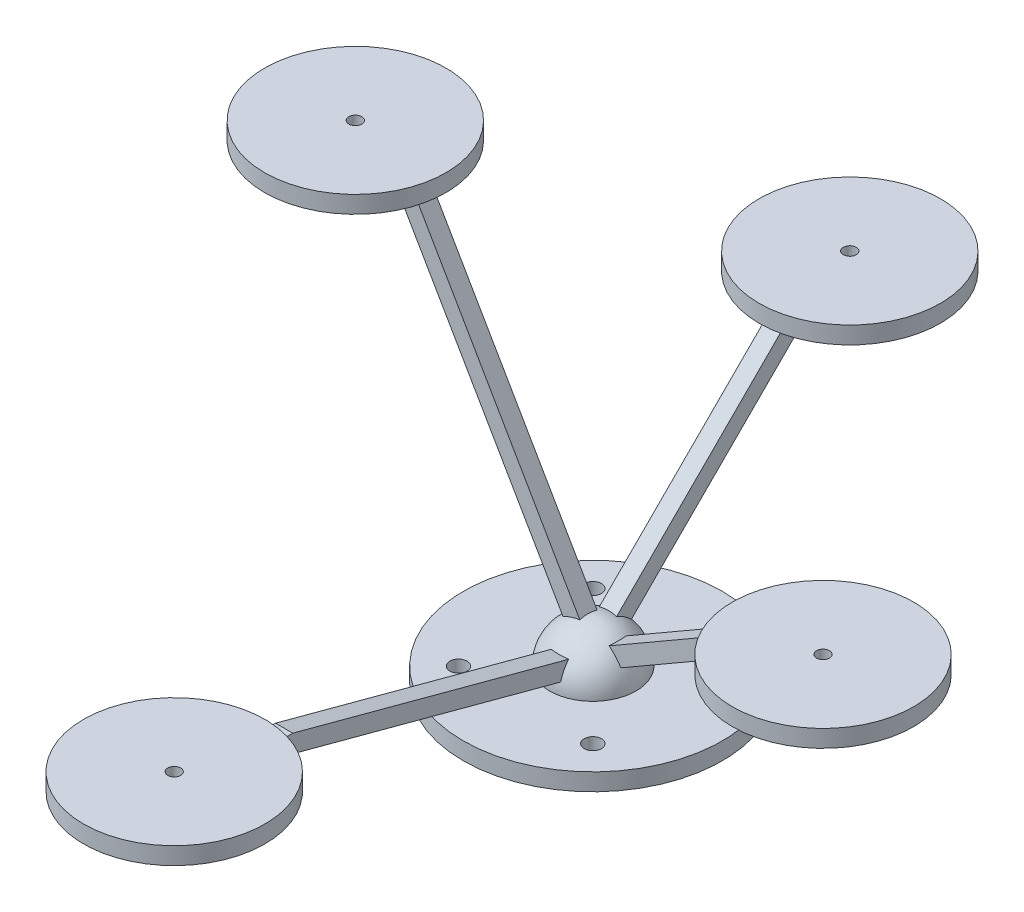
ISO-10303-21;
HEADER;
FILE_DESCRIPTION(('STEP AP214'),'2;1');
FILE_NAME('part.step','',(''),(''),'','','');
FILE_SCHEMA(('AUTOMOTIVE_DESIGN { 1 0 10303 214 1 1 1 1 }'));
ENDSEC;
DATA;
#1=APPLICATION_CONTEXT('core data for automotive mechanical design processes');
#2=APPLICATION_PROTOCOL_DEFINITION('international standard','automotive_design',2000,#1);
#3=PRODUCT_CONTEXT('',#1,'mechanical');
#4=PRODUCT('Part','Part','',(#3));
#5=PRODUCT_RELATED_PRODUCT_CATEGORY('part','',(#4));
#6=PRODUCT_DEFINITION_FORMATION('','',#4);
#7=PRODUCT_DEFINITION_CONTEXT('part definition',#1,'design');
#8=PRODUCT_DEFINITION('design','',#6,#7);
#9=PRODUCT_DEFINITION_SHAPE('','',#8);
#10=(LENGTH_UNIT() NAMED_UNIT(*) SI_UNIT(.MILLI.,.METRE.));
#11=(NAMED_UNIT(*) PLANE_ANGLE_UNIT() SI_UNIT($,.RADIAN.));
#12=(NAMED_UNIT(*) SI_UNIT($,.STERADIAN.) SOLID_ANGLE_UNIT());
#13=UNCERTAINTY_MEASURE_WITH_UNIT(LENGTH_MEASURE(1.E-05),#10,'distance_accuracy_value','');
#14=(GEOMETRIC_REPRESENTATION_CONTEXT(3) GLOBAL_UNCERTAINTY_ASSIGNED_CONTEXT((#13)) GLOBAL_UNIT_ASSIGNED_CONTEXT((#10,
#11,#12)) REPRESENTATION_CONTEXT('',''));
#15=CARTESIAN_POINT('',(0.,0.,0.));
#16=DIRECTION('',(0.,0.,1.));
#17=DIRECTION('',(1.,0.,0.));
#18=AXIS2_PLACEMENT_3D('',#15,#16,#17);
#19=CARTESIAN_POINT('',(0.,2.,0.));
#20=DIRECTION('',(0.,-1.,0.));
#21=DIRECTION('',(0.,0.,-1.));
#22=AXIS2_PLACEMENT_3D('',#19,#20,#21);
#23=SPHERICAL_SURFACE('',#22,5.);
#24=CARTESIAN_POINT('',(0.,2.,0.));
#25=DIRECTION('',(0.,1.,0.));
#26=DIRECTION('',(0.,0.,1.));
#27=AXIS2_PLACEMENT_3D('',#24,#25,#26);
#28=CIRCLE('',#27,5.);
#29=CARTESIAN_POINT('',(0.,2.,5.));
#30=VERTEX_POINT('',#29);
#31=EDGE_CURVE('E388',#30,#30,#28,.T.);
#32=ORIENTED_EDGE('',*,*,#31,.T.);
#33=EDGE_LOOP('',(#32));
#34=FACE_BOUND('',#33,.T.);
#35=CARTESIAN_POINT('',(1.73205080756889,3.,0.));
#36=DIRECTION('',(-0.86602540378444,-0.499999999999998,0.));
#37=DIRECTION('',(0.499999999999998,-0.86602540378444,0.));
#38=AXIS2_PLACEMENT_3D('',#35,#36,#37);
#39=CIRCLE('',#38,4.58257569495584);
#40=CARTESIAN_POINT('',(-0.504017169930898,6.87298334620742,-1.));
#41=VERTEX_POINT('',#40);
#42=CARTESIAN_POINT('',(-0.504017169930894,6.87298334620742,1.));
#43=VERTEX_POINT('',#42);
#44=EDGE_CURVE('E399',#41,#43,#39,.F.);
#45=ORIENTED_EDGE('',*,*,#44,.T.);
#46=CARTESIAN_POINT('',(0.,2.,1.));
#47=DIRECTION('',(0.,0.,-1.));
#48=DIRECTION('',(-1.,0.,0.));
#49=AXIS2_PLACEMENT_3D('',#46,#47,#48);
#50=CIRCLE('',#49,4.89897948556636);
#51=CARTESIAN_POINT('',(-2.44948974278317,6.24264068711929,1.));
#52=VERTEX_POINT('',#51);
#53=EDGE_CURVE('E406',#43,#52,#50,.F.);
#54=ORIENTED_EDGE('',*,*,#53,.T.);
#55=CARTESIAN_POINT('',(0.,2.,0.));
#56=DIRECTION('',(0.86602540378444,0.499999999999998,0.));
#57=DIRECTION('',(-0.499999999999998,0.86602540378444,0.));
#58=AXIS2_PLACEMENT_3D('',#55,#56,#57);
#59=CIRCLE('',#58,5.);
#60=CARTESIAN_POINT('',(-2.44948974278317,6.24264068711929,-1.));
#61=VERTEX_POINT('',#60);
#62=EDGE_CURVE('E403',#52,#61,#59,.F.);
#63=ORIENTED_EDGE('',*,*,#62,.T.);
#64=CARTESIAN_POINT('',(0.,2.,-1.));
#65=DIRECTION('',(0.,0.,-1.));
#66=DIRECTION('',(-1.,0.,0.));
#67=AXIS2_PLACEMENT_3D('',#64,#65,#66);
#68=CIRCLE('',#67,4.89897948556636);
#69=EDGE_CURVE('E395',#41,#61,#68,.F.);
#70=ORIENTED_EDGE('',*,*,#69,.F.);
#71=EDGE_LOOP('',(#45,#54,#63,#70));
#72=FACE_BOUND('',#71,.T.);
#73=CARTESIAN_POINT('',(0.,2.,0.));
#74=DIRECTION('',(-0.499999999999995,0.866025403784442,0.));
#75=DIRECTION('',(-0.866025403784442,-0.499999999999995,0.));
#76=AXIS2_PLACEMENT_3D('',#73,#74,#75);
#77=CIRCLE('',#76,5.);
#78=CARTESIAN_POINT('',(4.2426406871193,4.44948974278315,-1.));
#79=VERTEX_POINT('',#78);
#80=CARTESIAN_POINT('',(4.2426406871193,4.44948974278315,1.));
#81=VERTEX_POINT('',#80);
#82=EDGE_CURVE('E413',#79,#81,#77,.F.);
#83=ORIENTED_EDGE('',*,*,#82,.T.);
#84=CARTESIAN_POINT('',(2.87298334620744,5.96811878506865,1.));
#85=VERTEX_POINT('',#84);
#86=EDGE_CURVE('E409',#81,#85,#50,.F.);
#87=ORIENTED_EDGE('',*,*,#86,.T.);
#88=CARTESIAN_POINT('',(-0.999999999999988,3.73205080756888,0.));
#89=DIRECTION('',(0.499999999999995,-0.866025403784442,0.));
#90=DIRECTION('',(0.866025403784442,0.499999999999995,0.));
#91=AXIS2_PLACEMENT_3D('',#88,#89,#90);
#92=CIRCLE('',#91,4.58257569495584);
#93=CARTESIAN_POINT('',(2.87298334620744,5.96811878506865,-1.));
#94=VERTEX_POINT('',#93);
#95=EDGE_CURVE('E410',#85,#94,#92,.F.);
#96=ORIENTED_EDGE('',*,*,#95,.T.);
#97=EDGE_CURVE('E400',#79,#94,#68,.F.);
#98=ORIENTED_EDGE('',*,*,#97,.F.);
#99=EDGE_LOOP('',(#83,#87,#96,#98));
#100=FACE_BOUND('',#99,.T.);
#101=CARTESIAN_POINT('',(0.,3.93185165257814,-0.517638090205042));
#102=DIRECTION('',(0.,-0.965925826289068,0.258819045102521));
#103=DIRECTION('',(0.,-0.258819045102521,-0.965925826289068));
#104=AXIS2_PLACEMENT_3D('',#101,#102,#103);
#105=CIRCLE('',#104,4.58257569495584);
#106=CARTESIAN_POINT('',(-1.,5.08932561001978,3.80211352740498));
#107=VERTEX_POINT('',#106);
#108=CARTESIAN_POINT('',(1.,5.08932561001978,3.80211352740498));
#109=VERTEX_POINT('',#108);
#110=EDGE_CURVE('E419',#107,#109,#105,.F.);
#111=ORIENTED_EDGE('',*,*,#110,.T.);
#112=CARTESIAN_POINT('',(1.,2.,0.));
#113=DIRECTION('',(-1.,0.,0.));
#114=DIRECTION('',(0.,0.,1.));
#115=AXIS2_PLACEMENT_3D('',#112,#113,#114);
#116=CIRCLE('',#115,4.89897948556636);
#117=CARTESIAN_POINT('',(1.,3.26794919243113,4.73205080756888));
#118=VERTEX_POINT('',#117);
#119=EDGE_CURVE('E50',#109,#118,#116,.F.);
#120=ORIENTED_EDGE('',*,*,#119,.T.);
#121=CARTESIAN_POINT('',(0.,2.,0.));
#122=DIRECTION('',(0.,0.965925826289068,-0.258819045102521));
#123=DIRECTION('',(0.,0.258819045102521,0.965925826289068));
#124=AXIS2_PLACEMENT_3D('',#121,#122,#123);
#125=CIRCLE('',#124,5.);
#126=CARTESIAN_POINT('',(-1.,3.26794919243113,4.73205080756888));
#127=VERTEX_POINT('',#126);
#128=EDGE_CURVE('E423',#118,#127,#125,.F.);
#129=ORIENTED_EDGE('',*,*,#128,.T.);
#130=CARTESIAN_POINT('',(-1.,2.,0.));
#131=DIRECTION('',(-1.,0.,0.));
#132=DIRECTION('',(0.,0.,1.));
#133=AXIS2_PLACEMENT_3D('',#130,#131,#132);
#134=CIRCLE('',#133,4.89897948556636);
#135=EDGE_CURVE('E416',#107,#127,#134,.F.);
#136=ORIENTED_EDGE('',*,*,#135,.F.);
#137=EDGE_LOOP('',(#111,#120,#129,#136));
#138=FACE_BOUND('',#137,.T.);
#139=CARTESIAN_POINT('',(0.,2.,0.));
#140=DIRECTION('',(0.,0.707106781186551,0.707106781186544));
#141=DIRECTION('',(0.,-0.707106781186544,0.707106781186551));
#142=AXIS2_PLACEMENT_3D('',#139,#140,#141);
#143=CIRCLE('',#142,5.);
#144=CARTESIAN_POINT('',(-1.,5.46410161513774,-3.46410161513777));
#145=VERTEX_POINT('',#144);
#146=CARTESIAN_POINT('',(1.,5.46410161513774,-3.46410161513777));
#147=VERTEX_POINT('',#146);
#148=EDGE_CURVE('E43',#145,#147,#143,.F.);
#149=ORIENTED_EDGE('',*,*,#148,.T.);
#150=CARTESIAN_POINT('',(1.,6.57649122254147,-1.74806409779531));
#151=VERTEX_POINT('',#150);
#152=EDGE_CURVE('E11',#147,#151,#116,.F.);
#153=ORIENTED_EDGE('',*,*,#152,.T.);
#154=CARTESIAN_POINT('',(0.,3.4142135623731,1.41421356237309));
#155=DIRECTION('',(0.,-0.707106781186551,-0.707106781186544));
#156=DIRECTION('',(0.,0.707106781186544,-0.707106781186551));
#157=AXIS2_PLACEMENT_3D('',#154,#155,#156);
#158=CIRCLE('',#157,4.58257569495584);
#159=CARTESIAN_POINT('',(-1.,6.57649122254147,-1.74806409779531));
#160=VERTEX_POINT('',#159);
#161=EDGE_CURVE('E426',#151,#160,#158,.F.);
#162=ORIENTED_EDGE('',*,*,#161,.T.);
#163=EDGE_CURVE('E420',#145,#160,#134,.F.);
#164=ORIENTED_EDGE('',*,*,#163,.F.);
#165=EDGE_LOOP('',(#149,#153,#162,#164));
#166=FACE_BOUND('',#165,.T.);
#167=ADVANCED_FACE('F39',(#34,#72,#100,#138,#166),#23,.T.);
#168=CARTESIAN_POINT('',(0.,2.,0.));
#169=DIRECTION('',(0.,1.,0.));
#170=DIRECTION('',(0.,0.,1.));
#171=AXIS2_PLACEMENT_3D('',#168,#169,#170);
#172=PLANE('',#171);
#173=ORIENTED_EDGE('',*,*,#31,.F.);
#174=EDGE_LOOP('',(#173));
#175=FACE_BOUND('',#174,.T.);
#176=CARTESIAN_POINT('',(-7.77817459305207,2.,7.77817459305198));
#177=DIRECTION('',(0.,1.,0.));
#178=DIRECTION('',(0.,0.,1.));
#179=AXIS2_PLACEMENT_3D('',#176,#177,#178);
#180=CIRCLE('',#179,1.);
#181=CARTESIAN_POINT('',(-7.77817459305207,2.,8.77817459305198));
#182=VERTEX_POINT('',#181);
#183=EDGE_CURVE('E360',#182,#182,#180,.T.);
#184=ORIENTED_EDGE('',*,*,#183,.F.);
#185=EDGE_LOOP('',(#184));
#186=FACE_BOUND('',#185,.T.);
#187=CARTESIAN_POINT('',(7.77817459305206,2.,-7.77817459305199));
#188=DIRECTION('',(0.,1.,0.));
#189=DIRECTION('',(0.,0.,1.));
#190=AXIS2_PLACEMENT_3D('',#187,#188,#189);
#191=CIRCLE('',#190,1.);
#192=CARTESIAN_POINT('',(7.77817459305206,2.,-6.77817459305198));
#193=VERTEX_POINT('',#192);
#194=EDGE_CURVE('E376',#193,#193,#191,.T.);
#195=ORIENTED_EDGE('',*,*,#194,.F.);
#196=EDGE_LOOP('',(#195));
#197=FACE_BOUND('',#196,.T.);
#198=CARTESIAN_POINT('',(0.,2.,0.));
#199=DIRECTION('',(0.,1.,0.));
#200=DIRECTION('',(0.,0.,1.));
#201=AXIS2_PLACEMENT_3D('',#198,#199,#200);
#202=CIRCLE('',#201,15.);
#203=CARTESIAN_POINT('',(0.,2.,15.));
#204=VERTEX_POINT('',#203);
#205=EDGE_CURVE('E384',#204,#204,#202,.T.);
#206=ORIENTED_EDGE('',*,*,#205,.T.);
#207=EDGE_LOOP('',(#206));
#208=FACE_BOUND('',#207,.T.);
#209=CARTESIAN_POINT('',(-7.77817459305204,2.,-7.77817459305201));
#210=DIRECTION('',(0.,1.,0.));
#211=DIRECTION('',(0.,0.,1.));
#212=AXIS2_PLACEMENT_3D('',#209,#210,#211);
#213=CIRCLE('',#212,0.999999999999995);
#214=CARTESIAN_POINT('',(-7.77817459305204,2.,-6.77817459305201));
#215=VERTEX_POINT('',#214);
#216=EDGE_CURVE('E368',#215,#215,#213,.T.);
#217=ORIENTED_EDGE('',*,*,#216,.F.);
#218=EDGE_LOOP('',(#217));
#219=FACE_BOUND('',#218,.T.);
#220=CARTESIAN_POINT('',(7.77817459305204,2.,7.77817459305201));
#221=DIRECTION('',(0.,1.,0.));
#222=DIRECTION('',(0.,0.,1.));
#223=AXIS2_PLACEMENT_3D('',#220,#221,#222);
#224=CIRCLE('',#223,1.);
#225=CARTESIAN_POINT('',(7.77817459305204,2.,8.77817459305201));
#226=VERTEX_POINT('',#225);
#227=EDGE_CURVE('E352',#226,#226,#224,.T.);
#228=ORIENTED_EDGE('',*,*,#227,.F.);
#229=EDGE_LOOP('',(#228));
#230=FACE_BOUND('',#229,.T.);
#231=ADVANCED_FACE('F450',(#175,#186,#197,#208,#219,#230),#172,.T.);
#232=CARTESIAN_POINT('',(0.,0.,0.));
#233=DIRECTION('',(0.,1.,0.));
#234=DIRECTION('',(0.,0.,1.));
#235=AXIS2_PLACEMENT_3D('',#232,#233,#234);
#236=PLANE('',#235);
#237=CARTESIAN_POINT('',(0.,0.,0.));
#238=DIRECTION('',(0.,1.,0.));
#239=DIRECTION('',(0.,0.,1.));
#240=AXIS2_PLACEMENT_3D('',#237,#238,#239);
#241=CIRCLE('',#240,15.);
#242=CARTESIAN_POINT('',(0.,0.,15.));
#243=VERTEX_POINT('',#242);
#244=EDGE_CURVE('E380',#243,#243,#241,.T.);
#245=ORIENTED_EDGE('',*,*,#244,.F.);
#246=EDGE_LOOP('',(#245));
#247=FACE_BOUND('',#246,.T.);
#248=CARTESIAN_POINT('',(7.77817459305206,0.,-7.77817459305199));
#249=DIRECTION('',(0.,1.,0.));
#250=DIRECTION('',(0.,0.,1.));
#251=AXIS2_PLACEMENT_3D('',#248,#249,#250);
#252=CIRCLE('',#251,1.);
#253=CARTESIAN_POINT('',(7.77817459305206,0.,-6.77817459305198));
#254=VERTEX_POINT('',#253);
#255=EDGE_CURVE('E372',#254,#254,#252,.T.);
#256=ORIENTED_EDGE('',*,*,#255,.T.);
#257=EDGE_LOOP('',(#256));
#258=FACE_BOUND('',#257,.T.);
#259=CARTESIAN_POINT('',(-7.77817459305204,0.,-7.77817459305201));
#260=DIRECTION('',(0.,1.,0.));
#261=DIRECTION('',(0.,0.,1.));
#262=AXIS2_PLACEMENT_3D('',#259,#260,#261);
#263=CIRCLE('',#262,0.999999999999995);
#264=CARTESIAN_POINT('',(-7.77817459305204,0.,-6.77817459305201));
#265=VERTEX_POINT('',#264);
#266=EDGE_CURVE('E364',#265,#265,#263,.T.);
#267=ORIENTED_EDGE('',*,*,#266,.T.);
#268=EDGE_LOOP('',(#267));
#269=FACE_BOUND('',#268,.T.);
#270=CARTESIAN_POINT('',(-7.77817459305207,0.,7.77817459305198));
#271=DIRECTION('',(0.,1.,0.));
#272=DIRECTION('',(0.,0.,1.));
#273=AXIS2_PLACEMENT_3D('',#270,#271,#272);
#274=CIRCLE('',#273,1.);
#275=CARTESIAN_POINT('',(-7.77817459305207,0.,8.77817459305198));
#276=VERTEX_POINT('',#275);
#277=EDGE_CURVE('E356',#276,#276,#274,.T.);
#278=ORIENTED_EDGE('',*,*,#277,.T.);
#279=EDGE_LOOP('',(#278));
#280=FACE_BOUND('',#279,.T.);
#281=CARTESIAN_POINT('',(7.77817459305204,0.,7.77817459305201));
#282=DIRECTION('',(0.,1.,0.));
#283=DIRECTION('',(0.,0.,1.));
#284=AXIS2_PLACEMENT_3D('',#281,#282,#283);
#285=CIRCLE('',#284,1.);
#286=CARTESIAN_POINT('',(7.77817459305204,0.,8.77817459305201));
#287=VERTEX_POINT('',#286);
#288=EDGE_CURVE('E351',#287,#287,#285,.T.);
#289=ORIENTED_EDGE('',*,*,#288,.T.);
#290=EDGE_LOOP('',(#289));
#291=FACE_BOUND('',#290,.T.);
#292=ADVANCED_FACE('F458',(#247,#258,#269,#280,#291),#236,.F.);
#293=CARTESIAN_POINT('',(0.,2.,0.));
#294=DIRECTION('',(0.,-1.,0.));
#295=DIRECTION('',(0.,0.,-1.));
#296=AXIS2_PLACEMENT_3D('',#293,#294,#295);
#297=CYLINDRICAL_SURFACE('',#296,15.);
#298=ORIENTED_EDGE('',*,*,#205,.F.);
#299=EDGE_LOOP('',(#298));
#300=FACE_BOUND('',#299,.T.);
#301=ORIENTED_EDGE('',*,*,#244,.T.);
#302=EDGE_LOOP('',(#301));
#303=FACE_BOUND('',#302,.T.);
#304=ADVANCED_FACE('F41',(#300,#303),#297,.T.);
#305=CARTESIAN_POINT('',(7.77817459305206,2.,-7.77817459305199));
#306=DIRECTION('',(0.,-1.,0.));
#307=DIRECTION('',(0.,0.,-1.));
#308=AXIS2_PLACEMENT_3D('',#305,#306,#307);
#309=CYLINDRICAL_SURFACE('',#308,1.);
#310=ORIENTED_EDGE('',*,*,#194,.T.);
#311=EDGE_LOOP('',(#310));
#312=FACE_BOUND('',#311,.T.);
#313=ORIENTED_EDGE('',*,*,#255,.F.);
#314=EDGE_LOOP('',(#313));
#315=FACE_BOUND('',#314,.T.);
#316=ADVANCED_FACE('F478',(#312,#315),#309,.F.);
#317=CARTESIAN_POINT('',(-7.77817459305204,2.,-7.77817459305201));
#318=DIRECTION('',(0.,-1.,0.));
#319=DIRECTION('',(0.,0.,-1.));
#320=AXIS2_PLACEMENT_3D('',#317,#318,#319);
#321=CYLINDRICAL_SURFACE('',#320,0.999999999999995);
#322=ORIENTED_EDGE('',*,*,#216,.T.);
#323=EDGE_LOOP('',(#322));
#324=FACE_BOUND('',#323,.T.);
#325=ORIENTED_EDGE('',*,*,#266,.F.);
#326=EDGE_LOOP('',(#325));
#327=FACE_BOUND('',#326,.T.);
#328=ADVANCED_FACE('F474',(#324,#327),#321,.F.);
#329=CARTESIAN_POINT('',(-7.77817459305207,2.,7.77817459305198));
#330=DIRECTION('',(0.,-1.,0.));
#331=DIRECTION('',(0.,0.,-1.));
#332=AXIS2_PLACEMENT_3D('',#329,#330,#331);
#333=CYLINDRICAL_SURFACE('',#332,1.);
#334=ORIENTED_EDGE('',*,*,#183,.T.);
#335=EDGE_LOOP('',(#334));
#336=FACE_BOUND('',#335,.T.);
#337=ORIENTED_EDGE('',*,*,#277,.F.);
#338=EDGE_LOOP('',(#337));
#339=FACE_BOUND('',#338,.T.);
#340=ADVANCED_FACE('F470',(#336,#339),#333,.F.);
#341=CARTESIAN_POINT('',(7.77817459305204,2.,7.77817459305201));
#342=DIRECTION('',(0.,-1.,0.));
#343=DIRECTION('',(0.,0.,-1.));
#344=AXIS2_PLACEMENT_3D('',#341,#342,#343);
#345=CYLINDRICAL_SURFACE('',#344,1.);
#346=ORIENTED_EDGE('',*,*,#227,.T.);
#347=EDGE_LOOP('',(#346));
#348=FACE_BOUND('',#347,.T.);
#349=ORIENTED_EDGE('',*,*,#288,.F.);
#350=EDGE_LOOP('',(#349));
#351=FACE_BOUND('',#350,.T.);
#352=ADVANCED_FACE('F466',(#348,#351),#345,.F.);
#353=CARTESIAN_POINT('',(0.,0.,1.));
#354=DIRECTION('',(0.,0.,-1.));
#355=DIRECTION('',(-1.,0.,0.));
#356=AXIS2_PLACEMENT_3D('',#353,#354,#355);
#357=PLANE('',#356);
#358=ORIENTED_EDGE('',*,*,#53,.F.);
#359=DIRECTION('',(-0.499999999999998,0.86602540378444,0.));
#360=VECTOR('',#359,1.);
#361=CARTESIAN_POINT('',(-20.1905989232414,40.9711431702998,1.));
#362=LINE('',#361,#360);
#363=CARTESIAN_POINT('',(-20.1905989232414,40.9711431702998,1.));
#364=VERTEX_POINT('',#363);
#365=EDGE_CURVE('E309',#43,#364,#362,.T.);
#366=ORIENTED_EDGE('',*,*,#365,.T.);
#367=DIRECTION('',(-1.,0.,0.));
#368=VECTOR('',#367,1.);
#369=CARTESIAN_POINT('',(-22.4999999999999,40.9711431702998,1.));
#370=LINE('',#369,#368);
#371=CARTESIAN_POINT('',(-22.4999999999999,40.9711431702998,1.));
#372=VERTEX_POINT('',#371);
#373=EDGE_CURVE('E312',#364,#372,#370,.T.);
#374=ORIENTED_EDGE('',*,*,#373,.T.);
#375=DIRECTION('',(0.499999999999998,-0.86602540378444,0.));
#376=VECTOR('',#375,1.);
#377=CARTESIAN_POINT('',(0.,2.,1.));
#378=LINE('',#377,#376);
#379=EDGE_CURVE('E294',#372,#52,#378,.T.);
#380=ORIENTED_EDGE('',*,*,#379,.T.);
#381=EDGE_LOOP('',(#358,#366,#374,#380));
#382=FACE_BOUND('',#381,.T.);
#383=ADVANCED_FACE('F469',(#382),#357,.F.);
#384=CARTESIAN_POINT('',(0.,0.,-1.));
#385=DIRECTION('',(0.,0.,-1.));
#386=DIRECTION('',(-1.,0.,0.));
#387=AXIS2_PLACEMENT_3D('',#384,#385,#386);
#388=PLANE('',#387);
#389=DIRECTION('',(-0.499999999999998,0.86602540378444,0.));
#390=VECTOR('',#389,1.);
#391=CARTESIAN_POINT('',(-20.1905989232414,40.9711431702998,-1.));
#392=LINE('',#391,#390);
#393=CARTESIAN_POINT('',(-20.1905989232414,40.9711431702998,-1.));
#394=VERTEX_POINT('',#393);
#395=EDGE_CURVE('E331',#41,#394,#392,.T.);
#396=ORIENTED_EDGE('',*,*,#395,.F.);
#397=ORIENTED_EDGE('',*,*,#69,.T.);
#398=DIRECTION('',(0.499999999999998,-0.86602540378444,0.));
#399=VECTOR('',#398,1.);
#400=CARTESIAN_POINT('',(0.,2.,-1.));
#401=LINE('',#400,#399);
#402=CARTESIAN_POINT('',(-22.4999999999999,40.9711431702998,-1.));
#403=VERTEX_POINT('',#402);
#404=EDGE_CURVE('E290',#403,#61,#401,.T.);
#405=ORIENTED_EDGE('',*,*,#404,.F.);
#406=DIRECTION('',(-1.,0.,0.));
#407=VECTOR('',#406,1.);
#408=CARTESIAN_POINT('',(-22.4999999999999,40.9711431702998,-1.));
#409=LINE('',#408,#407);
#410=EDGE_CURVE('E299',#394,#403,#409,.T.);
#411=ORIENTED_EDGE('',*,*,#410,.F.);
#412=EDGE_LOOP('',(#396,#397,#405,#411));
#413=FACE_BOUND('',#412,.T.);
#414=ADVANCED_FACE('F539',(#413),#388,.T.);
#415=CARTESIAN_POINT('',(-20.1905989232414,40.9711431702998,1.));
#416=DIRECTION('',(-0.86602540378444,-0.499999999999998,0.));
#417=DIRECTION('',(0.499999999999998,-0.86602540378444,0.));
#418=AXIS2_PLACEMENT_3D('',#415,#416,#417);
#419=PLANE('',#418);
#420=ORIENTED_EDGE('',*,*,#44,.F.);
#421=ORIENTED_EDGE('',*,*,#395,.T.);
#422=DIRECTION('',(0.,0.,-1.));
#423=VECTOR('',#422,1.);
#424=CARTESIAN_POINT('',(-20.1905989232414,40.9711431702998,1.));
#425=LINE('',#424,#423);
#426=EDGE_CURVE('E340',#364,#394,#425,.T.);
#427=ORIENTED_EDGE('',*,*,#426,.F.);
#428=ORIENTED_EDGE('',*,*,#365,.F.);
#429=EDGE_LOOP('',(#420,#421,#427,#428));
#430=FACE_BOUND('',#429,.T.);
#431=ADVANCED_FACE('F549',(#430),#419,.F.);
#432=CARTESIAN_POINT('',(0.,2.,1.));
#433=DIRECTION('',(0.86602540378444,0.499999999999998,0.));
#434=DIRECTION('',(-0.499999999999998,0.86602540378444,0.));
#435=AXIS2_PLACEMENT_3D('',#432,#433,#434);
#436=PLANE('',#435);
#437=ORIENTED_EDGE('',*,*,#62,.F.);
#438=ORIENTED_EDGE('',*,*,#379,.F.);
#439=DIRECTION('',(0.,0.,-1.));
#440=VECTOR('',#439,1.);
#441=CARTESIAN_POINT('',(-22.4999999999999,40.9711431702998,1.));
#442=LINE('',#441,#440);
#443=EDGE_CURVE('E315',#372,#403,#442,.T.);
#444=ORIENTED_EDGE('',*,*,#443,.T.);
#445=ORIENTED_EDGE('',*,*,#404,.T.);
#446=EDGE_LOOP('',(#437,#438,#444,#445));
#447=FACE_BOUND('',#446,.T.);
#448=ADVANCED_FACE('F464',(#447),#436,.F.);
#449=ORIENTED_EDGE('',*,*,#86,.F.);
#450=DIRECTION('',(0.866025403784442,0.499999999999995,0.));
#451=VECTOR('',#450,1.);
#452=CARTESIAN_POINT('',(0.,2.,1.));
#453=LINE('',#452,#451);
#454=CARTESIAN_POINT('',(21.650635094611,14.4999999999999,1.));
#455=VERTEX_POINT('',#454);
#456=EDGE_CURVE('E298',#81,#455,#453,.T.);
#457=ORIENTED_EDGE('',*,*,#456,.T.);
#458=DIRECTION('',(-1.,0.,0.));
#459=VECTOR('',#458,1.);
#460=CARTESIAN_POINT('',(17.650635094611,14.4999999999999,1.));
#461=LINE('',#460,#459);
#462=CARTESIAN_POINT('',(17.650635094611,14.4999999999999,1.));
#463=VERTEX_POINT('',#462);
#464=EDGE_CURVE('E302',#455,#463,#461,.T.);
#465=ORIENTED_EDGE('',*,*,#464,.T.);
#466=DIRECTION('',(-0.866025403784442,-0.499999999999995,0.));
#467=VECTOR('',#466,1.);
#468=CARTESIAN_POINT('',(0.,4.30940107675849,1.));
#469=LINE('',#468,#467);
#470=EDGE_CURVE('E305',#463,#85,#469,.T.);
#471=ORIENTED_EDGE('',*,*,#470,.T.);
#472=EDGE_LOOP('',(#449,#457,#465,#471));
#473=FACE_BOUND('',#472,.T.);
#474=ADVANCED_FACE('F542',(#473),#357,.F.);
#475=DIRECTION('',(0.866025403784442,0.499999999999995,0.));
#476=VECTOR('',#475,1.);
#477=CARTESIAN_POINT('',(0.,2.,-1.));
#478=LINE('',#477,#476);
#479=CARTESIAN_POINT('',(21.650635094611,14.4999999999999,-1.));
#480=VERTEX_POINT('',#479);
#481=EDGE_CURVE('E319',#79,#480,#478,.T.);
#482=ORIENTED_EDGE('',*,*,#481,.F.);
#483=ORIENTED_EDGE('',*,*,#97,.T.);
#484=DIRECTION('',(-0.866025403784442,-0.499999999999995,0.));
#485=VECTOR('',#484,1.);
#486=CARTESIAN_POINT('',(0.,4.30940107675849,-1.));
#487=LINE('',#486,#485);
#488=CARTESIAN_POINT('',(17.650635094611,14.4999999999999,-1.));
#489=VERTEX_POINT('',#488);
#490=EDGE_CURVE('E327',#489,#94,#487,.T.);
#491=ORIENTED_EDGE('',*,*,#490,.F.);
#492=DIRECTION('',(-1.,0.,0.));
#493=VECTOR('',#492,1.);
#494=CARTESIAN_POINT('',(17.650635094611,14.4999999999999,-1.));
#495=LINE('',#494,#493);
#496=EDGE_CURVE('E323',#480,#489,#495,.T.);
#497=ORIENTED_EDGE('',*,*,#496,.F.);
#498=EDGE_LOOP('',(#482,#483,#491,#497));
#499=FACE_BOUND('',#498,.T.);
#500=ADVANCED_FACE('F552',(#499),#388,.T.);
#501=CARTESIAN_POINT('',(0.,2.,1.));
#502=DIRECTION('',(-0.499999999999995,0.866025403784442,0.));
#503=DIRECTION('',(-0.866025403784442,-0.499999999999995,0.));
#504=AXIS2_PLACEMENT_3D('',#501,#502,#503);
#505=PLANE('',#504);
#506=ORIENTED_EDGE('',*,*,#82,.F.);
#507=ORIENTED_EDGE('',*,*,#481,.T.);
#508=DIRECTION('',(0.,0.,-1.));
#509=VECTOR('',#508,1.);
#510=CARTESIAN_POINT('',(21.650635094611,14.4999999999999,1.));
#511=LINE('',#510,#509);
#512=EDGE_CURVE('E347',#455,#480,#511,.T.);
#513=ORIENTED_EDGE('',*,*,#512,.F.);
#514=ORIENTED_EDGE('',*,*,#456,.F.);
#515=EDGE_LOOP('',(#506,#507,#513,#514));
#516=FACE_BOUND('',#515,.T.);
#517=ADVANCED_FACE('F578',(#516),#505,.F.);
#518=CARTESIAN_POINT('',(0.,4.30940107675849,1.));
#519=DIRECTION('',(0.499999999999995,-0.866025403784442,0.));
#520=DIRECTION('',(0.866025403784442,0.499999999999995,0.));
#521=AXIS2_PLACEMENT_3D('',#518,#519,#520);
#522=PLANE('',#521);
#523=ORIENTED_EDGE('',*,*,#95,.F.);
#524=ORIENTED_EDGE('',*,*,#470,.F.);
#525=DIRECTION('',(0.,0.,-1.));
#526=VECTOR('',#525,1.);
#527=CARTESIAN_POINT('',(17.650635094611,14.4999999999999,1.));
#528=LINE('',#527,#526);
#529=EDGE_CURVE('E344',#463,#489,#528,.T.);
#530=ORIENTED_EDGE('',*,*,#529,.T.);
#531=ORIENTED_EDGE('',*,*,#490,.T.);
#532=EDGE_LOOP('',(#523,#524,#530,#531));
#533=FACE_BOUND('',#532,.T.);
#534=ADVANCED_FACE('F585',(#533),#522,.F.);
#535=CARTESIAN_POINT('',(26.650635094611,14.4999999999999,0.));
#536=DIRECTION('',(0.,1.,0.));
#537=DIRECTION('',(0.,0.,1.));
#538=AXIS2_PLACEMENT_3D('',#535,#536,#537);
#539=PLANE('',#538);
#540=CARTESIAN_POINT('',(26.650635094611,14.4999999999999,0.));
#541=DIRECTION('',(0.,1.,0.));
#542=DIRECTION('',(0.,0.,1.));
#543=AXIS2_PLACEMENT_3D('',#540,#541,#542);
#544=CIRCLE('',#543,10.5);
#545=CARTESIAN_POINT('',(26.650635094611,14.4999999999999,10.5));
#546=VERTEX_POINT('',#545);
#547=EDGE_CURVE('E282',#546,#546,#544,.T.);
#548=ORIENTED_EDGE('',*,*,#547,.F.);
#549=EDGE_LOOP('',(#548));
#550=FACE_BOUND('',#549,.T.);
#551=CARTESIAN_POINT('',(26.650635094611,14.4999999999999,0.));
#552=DIRECTION('',(0.,1.,0.));
#553=DIRECTION('',(0.,0.,1.));
#554=AXIS2_PLACEMENT_3D('',#551,#552,#553);
#555=CIRCLE('',#554,0.749999999999998);
#556=CARTESIAN_POINT('',(26.650635094611,14.4999999999999,0.749999999999998));
#557=VERTEX_POINT('',#556);
#558=EDGE_CURVE('E274',#557,#557,#555,.T.);
#559=ORIENTED_EDGE('',*,*,#558,.T.);
#560=EDGE_LOOP('',(#559));
#561=FACE_BOUND('',#560,.T.);
#562=ORIENTED_EDGE('',*,*,#512,.T.);
#563=ORIENTED_EDGE('',*,*,#496,.T.);
#564=ORIENTED_EDGE('',*,*,#529,.F.);
#565=ORIENTED_EDGE('',*,*,#464,.F.);
#566=EDGE_LOOP('',(#562,#563,#564,#565));
#567=FACE_BOUND('',#566,.T.);
#568=ADVANCED_FACE('F592',(#550,#561,#567),#539,.F.);
#569=CARTESIAN_POINT('',(26.650635094611,16.4999999999999,0.));
#570=DIRECTION('',(0.,1.,0.));
#571=DIRECTION('',(0.,0.,1.));
#572=AXIS2_PLACEMENT_3D('',#569,#570,#571);
#573=PLANE('',#572);
#574=CARTESIAN_POINT('',(26.650635094611,16.4999999999999,0.));
#575=DIRECTION('',(0.,1.,0.));
#576=DIRECTION('',(0.,0.,1.));
#577=AXIS2_PLACEMENT_3D('',#574,#575,#576);
#578=CIRCLE('',#577,10.5);
#579=CARTESIAN_POINT('',(26.650635094611,16.4999999999999,10.5));
#580=VERTEX_POINT('',#579);
#581=EDGE_CURVE('E286',#580,#580,#578,.T.);
#582=ORIENTED_EDGE('',*,*,#581,.T.);
#583=EDGE_LOOP('',(#582));
#584=FACE_BOUND('',#583,.T.);
#585=CARTESIAN_POINT('',(26.650635094611,16.4999999999999,0.));
#586=DIRECTION('',(0.,1.,0.));
#587=DIRECTION('',(0.,0.,1.));
#588=AXIS2_PLACEMENT_3D('',#585,#586,#587);
#589=CIRCLE('',#588,0.749999999999998);
#590=CARTESIAN_POINT('',(26.650635094611,16.4999999999999,0.749999999999998));
#591=VERTEX_POINT('',#590);
#592=EDGE_CURVE('E278',#591,#591,#589,.T.);
#593=ORIENTED_EDGE('',*,*,#592,.F.);
#594=EDGE_LOOP('',(#593));
#595=FACE_BOUND('',#594,.T.);
#596=ADVANCED_FACE('F600',(#584,#595),#573,.T.);
#597=CARTESIAN_POINT('',(26.650635094611,16.4999999999999,0.));
#598=DIRECTION('',(0.,-1.,0.));
#599=DIRECTION('',(0.,0.,-1.));
#600=AXIS2_PLACEMENT_3D('',#597,#598,#599);
#601=CYLINDRICAL_SURFACE('',#600,10.5);
#602=ORIENTED_EDGE('',*,*,#581,.F.);
#603=EDGE_LOOP('',(#602));
#604=FACE_BOUND('',#603,.T.);
#605=ORIENTED_EDGE('',*,*,#547,.T.);
#606=EDGE_LOOP('',(#605));
#607=FACE_BOUND('',#606,.T.);
#608=ADVANCED_FACE('F608',(#604,#607),#601,.T.);
#609=CARTESIAN_POINT('',(26.650635094611,16.4999999999999,0.));
#610=DIRECTION('',(0.,-1.,0.));
#611=DIRECTION('',(0.,0.,-1.));
#612=AXIS2_PLACEMENT_3D('',#609,#610,#611);
#613=CYLINDRICAL_SURFACE('',#612,0.749999999999998);
#614=ORIENTED_EDGE('',*,*,#592,.T.);
#615=EDGE_LOOP('',(#614));
#616=FACE_BOUND('',#615,.T.);
#617=ORIENTED_EDGE('',*,*,#558,.F.);
#618=EDGE_LOOP('',(#617));
#619=FACE_BOUND('',#618,.T.);
#620=ADVANCED_FACE('F616',(#616,#619),#613,.F.);
#621=CARTESIAN_POINT('',(-27.4999999999999,40.9711431702998,0.));
#622=DIRECTION('',(0.,1.,0.));
#623=DIRECTION('',(0.,0.,1.));
#624=AXIS2_PLACEMENT_3D('',#621,#622,#623);
#625=PLANE('',#624);
#626=CARTESIAN_POINT('',(-27.4999999999999,40.9711431702998,0.));
#627=DIRECTION('',(0.,1.,0.));
#628=DIRECTION('',(0.,0.,1.));
#629=AXIS2_PLACEMENT_3D('',#626,#627,#628);
#630=CIRCLE('',#629,10.5);
#631=CARTESIAN_POINT('',(-27.4999999999999,40.9711431702998,10.5));
#632=VERTEX_POINT('',#631);
#633=EDGE_CURVE('E266',#632,#632,#630,.T.);
#634=ORIENTED_EDGE('',*,*,#633,.F.);
#635=EDGE_LOOP('',(#634));
#636=FACE_BOUND('',#635,.T.);
#637=CARTESIAN_POINT('',(-27.4999999999999,40.9711431702998,0.));
#638=DIRECTION('',(0.,1.,0.));
#639=DIRECTION('',(0.,0.,1.));
#640=AXIS2_PLACEMENT_3D('',#637,#638,#639);
#641=CIRCLE('',#640,0.749999999999998);
#642=CARTESIAN_POINT('',(-27.4999999999999,40.9711431702998,0.749999999999998));
#643=VERTEX_POINT('',#642);
#644=EDGE_CURVE('E261',#643,#643,#641,.T.);
#645=ORIENTED_EDGE('',*,*,#644,.T.);
#646=EDGE_LOOP('',(#645));
#647=FACE_BOUND('',#646,.T.);
#648=ORIENTED_EDGE('',*,*,#426,.T.);
#649=ORIENTED_EDGE('',*,*,#410,.T.);
#650=ORIENTED_EDGE('',*,*,#443,.F.);
#651=ORIENTED_EDGE('',*,*,#373,.F.);
#652=EDGE_LOOP('',(#648,#649,#650,#651));
#653=FACE_BOUND('',#652,.T.);
#654=ADVANCED_FACE('F623',(#636,#647,#653),#625,.F.);
#655=CARTESIAN_POINT('',(-27.4999999999999,42.9711431702998,0.));
#656=DIRECTION('',(0.,1.,0.));
#657=DIRECTION('',(0.,0.,1.));
#658=AXIS2_PLACEMENT_3D('',#655,#656,#657);
#659=PLANE('',#658);
#660=CARTESIAN_POINT('',(-27.4999999999999,42.9711431702998,0.));
#661=DIRECTION('',(0.,1.,0.));
#662=DIRECTION('',(0.,0.,1.));
#663=AXIS2_PLACEMENT_3D('',#660,#661,#662);
#664=CIRCLE('',#663,10.5);
#665=CARTESIAN_POINT('',(-27.4999999999999,42.9711431702998,10.5));
#666=VERTEX_POINT('',#665);
#667=EDGE_CURVE('E270',#666,#666,#664,.T.);
#668=ORIENTED_EDGE('',*,*,#667,.T.);
#669=EDGE_LOOP('',(#668));
#670=FACE_BOUND('',#669,.T.);
#671=CARTESIAN_POINT('',(-27.4999999999999,42.9711431702998,0.));
#672=DIRECTION('',(0.,1.,0.));
#673=DIRECTION('',(0.,0.,1.));
#674=AXIS2_PLACEMENT_3D('',#671,#672,#673);
#675=CIRCLE('',#674,0.749999999999998);
#676=CARTESIAN_POINT('',(-27.4999999999999,42.9711431702998,0.749999999999998));
#677=VERTEX_POINT('',#676);
#678=EDGE_CURVE('E262',#677,#677,#675,.T.);
#679=ORIENTED_EDGE('',*,*,#678,.F.);
#680=EDGE_LOOP('',(#679));
#681=FACE_BOUND('',#680,.T.);
#682=ADVANCED_FACE('F630',(#670,#681),#659,.T.);
#683=CARTESIAN_POINT('',(-27.4999999999999,42.9711431702998,0.));
#684=DIRECTION('',(0.,-1.,0.));
#685=DIRECTION('',(0.,0.,-1.));
#686=AXIS2_PLACEMENT_3D('',#683,#684,#685);
#687=CYLINDRICAL_SURFACE('',#686,10.5);
#688=ORIENTED_EDGE('',*,*,#667,.F.);
#689=EDGE_LOOP('',(#688));
#690=FACE_BOUND('',#689,.T.);
#691=ORIENTED_EDGE('',*,*,#633,.T.);
#692=EDGE_LOOP('',(#691));
#693=FACE_BOUND('',#692,.T.);
#694=ADVANCED_FACE('F638',(#690,#693),#687,.T.);
#695=CARTESIAN_POINT('',(-27.4999999999999,42.9711431702998,0.));
#696=DIRECTION('',(0.,-1.,0.));
#697=DIRECTION('',(0.,0.,-1.));
#698=AXIS2_PLACEMENT_3D('',#695,#696,#697);
#699=CYLINDRICAL_SURFACE('',#698,0.749999999999998);
#700=ORIENTED_EDGE('',*,*,#678,.T.);
#701=EDGE_LOOP('',(#700));
#702=FACE_BOUND('',#701,.T.);
#703=ORIENTED_EDGE('',*,*,#644,.F.);
#704=EDGE_LOOP('',(#703));
#705=FACE_BOUND('',#704,.T.);
#706=ADVANCED_FACE('F646',(#702,#705),#699,.F.);
#707=CARTESIAN_POINT('',(1.,13.6468570296135,43.4666621830081));
#708=DIRECTION('',(0.,-1.,0.));
#709=DIRECTION('',(0.,0.,-1.));
#710=AXIS2_PLACEMENT_3D('',#707,#708,#709);
#711=PLANE('',#710);
#712=CARTESIAN_POINT('',(0.,13.6468570296135,48.4666621830081));
#713=DIRECTION('',(0.,1.,0.));
#714=DIRECTION('',(0.,0.,1.));
#715=AXIS2_PLACEMENT_3D('',#712,#713,#714);
#716=CIRCLE('',#715,10.5);
#717=CARTESIAN_POINT('',(1.,13.6468570296134,38.0143897028246));
#718=VERTEX_POINT('',#717);
#719=CARTESIAN_POINT('',(-1.,13.6468570296135,38.0143897028246));
#720=VERTEX_POINT('',#719);
#721=EDGE_CURVE('E57',#718,#720,#716,.T.);
#722=ORIENTED_EDGE('',*,*,#721,.F.);
#723=DIRECTION('',(0.,0.,1.));
#724=VECTOR('',#723,1.);
#725=CARTESIAN_POINT('',(1.,13.6468570296135,43.4666621830081));
#726=LINE('',#725,#724);
#727=CARTESIAN_POINT('',(1.,13.6468570296135,35.7392555726955));
#728=VERTEX_POINT('',#727);
#729=EDGE_CURVE('E230',#728,#718,#726,.T.);
#730=ORIENTED_EDGE('',*,*,#729,.F.);
#731=DIRECTION('',(-1.,0.,0.));
#732=VECTOR('',#731,1.);
#733=CARTESIAN_POINT('',(1.,13.6468570296135,35.7392555726955));
#734=LINE('',#733,#732);
#735=CARTESIAN_POINT('',(-1.,13.6468570296135,35.7392555726955));
#736=VERTEX_POINT('',#735);
#737=EDGE_CURVE('E163',#728,#736,#734,.T.);
#738=ORIENTED_EDGE('',*,*,#737,.T.);
#739=DIRECTION('',(0.,0.,1.));
#740=VECTOR('',#739,1.);
#741=CARTESIAN_POINT('',(-1.,13.6468570296135,43.4666621830081));
#742=LINE('',#741,#740);
#743=EDGE_CURVE('E159',#736,#720,#742,.T.);
#744=ORIENTED_EDGE('',*,*,#743,.T.);
#745=EDGE_LOOP('',(#722,#730,#738,#744));
#746=FACE_BOUND('',#745,.T.);
#747=ADVANCED_FACE('F161',(#746),#711,.F.);
#748=CARTESIAN_POINT('',(1.,0.,0.));
#749=DIRECTION('',(-1.,0.,0.));
#750=DIRECTION('',(0.,0.,1.));
#751=AXIS2_PLACEMENT_3D('',#748,#749,#750);
#752=PLANE('',#751);
#753=ORIENTED_EDGE('',*,*,#119,.F.);
#754=DIRECTION('',(0.,0.258819045102521,0.965925826289068));
#755=VECTOR('',#754,1.);
#756=CARTESIAN_POINT('',(1.,4.07055236082017,0.));
#757=LINE('',#756,#755);
#758=EDGE_CURVE('E227',#109,#728,#757,.T.);
#759=ORIENTED_EDGE('',*,*,#758,.T.);
#760=ORIENTED_EDGE('',*,*,#729,.T.);
#761=CARTESIAN_POINT('',(1.,13.6468570296135,43.4666621830081));
#762=VERTEX_POINT('',#761);
#763=EDGE_CURVE('E185',#718,#762,#726,.T.);
#764=ORIENTED_EDGE('',*,*,#763,.T.);
#765=DIRECTION('',(0.,-0.258819045102521,-0.965925826289068));
#766=VECTOR('',#765,1.);
#767=CARTESIAN_POINT('',(1.,2.,0.));
#768=LINE('',#767,#766);
#769=EDGE_CURVE('E167',#762,#118,#768,.T.);
#770=ORIENTED_EDGE('',*,*,#769,.T.);
#771=EDGE_LOOP('',(#753,#759,#760,#764,#770));
#772=FACE_BOUND('',#771,.T.);
#773=ADVANCED_FACE('F659',(#772),#752,.F.);
#774=CARTESIAN_POINT('',(-1.,0.,0.));
#775=DIRECTION('',(-1.,0.,0.));
#776=DIRECTION('',(0.,0.,1.));
#777=AXIS2_PLACEMENT_3D('',#774,#775,#776);
#778=PLANE('',#777);
#779=DIRECTION('',(0.,0.258819045102521,0.965925826289068));
#780=VECTOR('',#779,1.);
#781=CARTESIAN_POINT('',(-1.,4.07055236082017,0.));
#782=LINE('',#781,#780);
#783=EDGE_CURVE('E180',#107,#736,#782,.T.);
#784=ORIENTED_EDGE('',*,*,#783,.F.);
#785=ORIENTED_EDGE('',*,*,#135,.T.);
#786=DIRECTION('',(0.,-0.258819045102521,-0.965925826289068));
#787=VECTOR('',#786,1.);
#788=CARTESIAN_POINT('',(-1.,2.,0.));
#789=LINE('',#788,#787);
#790=CARTESIAN_POINT('',(-1.,13.6468570296135,43.4666621830081));
#791=VERTEX_POINT('',#790);
#792=EDGE_CURVE('E176',#791,#127,#789,.T.);
#793=ORIENTED_EDGE('',*,*,#792,.F.);
#794=EDGE_CURVE('E168',#720,#791,#742,.T.);
#795=ORIENTED_EDGE('',*,*,#794,.F.);
#796=ORIENTED_EDGE('',*,*,#743,.F.);
#797=EDGE_LOOP('',(#784,#785,#793,#795,#796));
#798=FACE_BOUND('',#797,.T.);
#799=ADVANCED_FACE('F173',(#798),#778,.T.);
#800=CARTESIAN_POINT('',(1.,4.07055236082017,0.));
#801=DIRECTION('',(0.,-0.965925826289068,0.258819045102521));
#802=DIRECTION('',(0.,-0.258819045102521,-0.965925826289068));
#803=AXIS2_PLACEMENT_3D('',#800,#801,#802);
#804=PLANE('',#803);
#805=ORIENTED_EDGE('',*,*,#110,.F.);
#806=ORIENTED_EDGE('',*,*,#783,.T.);
#807=ORIENTED_EDGE('',*,*,#737,.F.);
#808=ORIENTED_EDGE('',*,*,#758,.F.);
#809=EDGE_LOOP('',(#805,#806,#807,#808));
#810=FACE_BOUND('',#809,.T.);
#811=ADVANCED_FACE('F673',(#810),#804,.F.);
#812=CARTESIAN_POINT('',(1.,2.,0.));
#813=DIRECTION('',(0.,0.965925826289068,-0.258819045102521));
#814=DIRECTION('',(0.,0.258819045102521,0.965925826289068));
#815=AXIS2_PLACEMENT_3D('',#812,#813,#814);
#816=PLANE('',#815);
#817=ORIENTED_EDGE('',*,*,#128,.F.);
#818=ORIENTED_EDGE('',*,*,#769,.F.);
#819=DIRECTION('',(-1.,0.,0.));
#820=VECTOR('',#819,1.);
#821=CARTESIAN_POINT('',(1.,13.6468570296135,43.4666621830081));
#822=LINE('',#821,#820);
#823=EDGE_CURVE('E233',#762,#791,#822,.T.);
#824=ORIENTED_EDGE('',*,*,#823,.T.);
#825=ORIENTED_EDGE('',*,*,#792,.T.);
#826=EDGE_LOOP('',(#817,#818,#824,#825));
#827=FACE_BOUND('',#826,.T.);
#828=ADVANCED_FACE('F680',(#827),#816,.F.);
#829=ORIENTED_EDGE('',*,*,#152,.F.);
#830=DIRECTION('',(0.,0.707106781186544,-0.707106781186551));
#831=VECTOR('',#830,1.);
#832=CARTESIAN_POINT('',(1.,2.,0.));
#833=LINE('',#832,#831);
#834=CARTESIAN_POINT('',(1.,26.748737341529,-24.7487373415293));
#835=VERTEX_POINT('',#834);
#836=EDGE_CURVE('E217',#147,#835,#833,.T.);
#837=ORIENTED_EDGE('',*,*,#836,.T.);
#838=DIRECTION('',(0.,0.,1.));
#839=VECTOR('',#838,1.);
#840=CARTESIAN_POINT('',(1.,26.748737341529,-21.9203102167831));
#841=LINE('',#840,#839);
#842=CARTESIAN_POINT('',(1.,26.748737341529,-21.9203102167831));
#843=VERTEX_POINT('',#842);
#844=EDGE_CURVE('E220',#835,#843,#841,.T.);
#845=ORIENTED_EDGE('',*,*,#844,.T.);
#846=DIRECTION('',(0.,-0.707106781186544,0.707106781186551));
#847=VECTOR('',#846,1.);
#848=CARTESIAN_POINT('',(1.,4.82842712474617,0.));
#849=LINE('',#848,#847);
#850=EDGE_CURVE('E223',#843,#151,#849,.T.);
#851=ORIENTED_EDGE('',*,*,#850,.T.);
#852=EDGE_LOOP('',(#829,#837,#845,#851));
#853=FACE_BOUND('',#852,.T.);
#854=ADVANCED_FACE('F448',(#853),#752,.F.);
#855=DIRECTION('',(0.,0.707106781186544,-0.707106781186551));
#856=VECTOR('',#855,1.);
#857=CARTESIAN_POINT('',(-1.,2.,0.));
#858=LINE('',#857,#856);
#859=CARTESIAN_POINT('',(-1.,26.748737341529,-24.7487373415293));
#860=VERTEX_POINT('',#859);
#861=EDGE_CURVE('E236',#145,#860,#858,.T.);
#862=ORIENTED_EDGE('',*,*,#861,.F.);
#863=ORIENTED_EDGE('',*,*,#163,.T.);
#864=DIRECTION('',(0.,-0.707106781186544,0.707106781186551));
#865=VECTOR('',#864,1.);
#866=CARTESIAN_POINT('',(-1.,4.82842712474617,0.));
#867=LINE('',#866,#865);
#868=CARTESIAN_POINT('',(-1.,26.748737341529,-21.9203102167831));
#869=VERTEX_POINT('',#868);
#870=EDGE_CURVE('E244',#869,#160,#867,.T.);
#871=ORIENTED_EDGE('',*,*,#870,.F.);
#872=DIRECTION('',(0.,0.,1.));
#873=VECTOR('',#872,1.);
#874=CARTESIAN_POINT('',(-1.,26.748737341529,-21.9203102167831));
#875=LINE('',#874,#873);
#876=EDGE_CURVE('E240',#860,#869,#875,.T.);
#877=ORIENTED_EDGE('',*,*,#876,.F.);
#878=EDGE_LOOP('',(#862,#863,#871,#877));
#879=FACE_BOUND('',#878,.T.);
#880=ADVANCED_FACE('F435',(#879),#778,.T.);
#881=CARTESIAN_POINT('',(1.,2.,0.));
#882=DIRECTION('',(0.,0.707106781186551,0.707106781186544));
#883=DIRECTION('',(0.,-0.707106781186544,0.707106781186551));
#884=AXIS2_PLACEMENT_3D('',#881,#882,#883);
#885=PLANE('',#884);
#886=ORIENTED_EDGE('',*,*,#148,.F.);
#887=ORIENTED_EDGE('',*,*,#861,.T.);
#888=DIRECTION('',(-1.,0.,0.));
#889=VECTOR('',#888,1.);
#890=CARTESIAN_POINT('',(1.,26.748737341529,-24.7487373415293));
#891=LINE('',#890,#889);
#892=EDGE_CURVE('E257',#835,#860,#891,.T.);
#893=ORIENTED_EDGE('',*,*,#892,.F.);
#894=ORIENTED_EDGE('',*,*,#836,.F.);
#895=EDGE_LOOP('',(#886,#887,#893,#894));
#896=FACE_BOUND('',#895,.T.);
#897=ADVANCED_FACE('F445',(#896),#885,.F.);
#898=CARTESIAN_POINT('',(1.,4.82842712474617,0.));
#899=DIRECTION('',(0.,-0.707106781186551,-0.707106781186544));
#900=DIRECTION('',(0.,0.707106781186544,-0.707106781186551));
#901=AXIS2_PLACEMENT_3D('',#898,#899,#900);
#902=PLANE('',#901);
#903=ORIENTED_EDGE('',*,*,#161,.F.);
#904=ORIENTED_EDGE('',*,*,#850,.F.);
#905=DIRECTION('',(-1.,0.,0.));
#906=VECTOR('',#905,1.);
#907=CARTESIAN_POINT('',(1.,26.748737341529,-21.9203102167831));
#908=LINE('',#907,#906);
#909=EDGE_CURVE('E254',#843,#869,#908,.T.);
#910=ORIENTED_EDGE('',*,*,#909,.T.);
#911=ORIENTED_EDGE('',*,*,#870,.T.);
#912=EDGE_LOOP('',(#903,#904,#910,#911));
#913=FACE_BOUND('',#912,.T.);
#914=ADVANCED_FACE('F437',(#913),#902,.F.);
#915=CARTESIAN_POINT('',(0.,26.748737341529,-29.7487373415293));
#916=DIRECTION('',(0.,1.,0.));
#917=DIRECTION('',(0.,0.,1.));
#918=AXIS2_PLACEMENT_3D('',#915,#916,#917);
#919=PLANE('',#918);
#920=CARTESIAN_POINT('',(0.,26.748737341529,-29.7487373415293));
#921=DIRECTION('',(0.,1.,0.));
#922=DIRECTION('',(0.,0.,1.));
#923=AXIS2_PLACEMENT_3D('',#920,#921,#922);
#924=CIRCLE('',#923,10.5);
#925=CARTESIAN_POINT('',(0.,26.748737341529,-19.2487373415293));
#926=VERTEX_POINT('',#925);
#927=EDGE_CURVE('E203',#926,#926,#924,.T.);
#928=ORIENTED_EDGE('',*,*,#927,.F.);
#929=EDGE_LOOP('',(#928));
#930=FACE_BOUND('',#929,.T.);
#931=CARTESIAN_POINT('',(0.,26.748737341529,-29.7487373415293));
#932=DIRECTION('',(0.,1.,0.));
#933=DIRECTION('',(0.,0.,1.));
#934=AXIS2_PLACEMENT_3D('',#931,#932,#933);
#935=CIRCLE('',#934,0.750000000000001);
#936=CARTESIAN_POINT('',(0.,26.748737341529,-28.9987373415293));
#937=VERTEX_POINT('',#936);
#938=EDGE_CURVE('E195',#937,#937,#935,.T.);
#939=ORIENTED_EDGE('',*,*,#938,.T.);
#940=EDGE_LOOP('',(#939));
#941=FACE_BOUND('',#940,.T.);
#942=ORIENTED_EDGE('',*,*,#892,.T.);
#943=ORIENTED_EDGE('',*,*,#876,.T.);
#944=ORIENTED_EDGE('',*,*,#909,.F.);
#945=ORIENTED_EDGE('',*,*,#844,.F.);
#946=EDGE_LOOP('',(#942,#943,#944,#945));
#947=FACE_BOUND('',#946,.T.);
#948=ADVANCED_FACE('F442',(#930,#941,#947),#919,.F.);
#949=CARTESIAN_POINT('',(0.,28.748737341529,-29.7487373415293));
#950=DIRECTION('',(0.,1.,0.));
#951=DIRECTION('',(0.,0.,1.));
#952=AXIS2_PLACEMENT_3D('',#949,#950,#951);
#953=PLANE('',#952);
#954=CARTESIAN_POINT('',(0.,28.748737341529,-29.7487373415293));
#955=DIRECTION('',(0.,1.,0.));
#956=DIRECTION('',(0.,0.,1.));
#957=AXIS2_PLACEMENT_3D('',#954,#955,#956);
#958=CIRCLE('',#957,10.5);
#959=CARTESIAN_POINT('',(0.,28.748737341529,-19.2487373415293));
#960=VERTEX_POINT('',#959);
#961=EDGE_CURVE('E207',#960,#960,#958,.T.);
#962=ORIENTED_EDGE('',*,*,#961,.T.);
#963=EDGE_LOOP('',(#962));
#964=FACE_BOUND('',#963,.T.);
#965=CARTESIAN_POINT('',(0.,28.748737341529,-29.7487373415293));
#966=DIRECTION('',(0.,1.,0.));
#967=DIRECTION('',(0.,0.,1.));
#968=AXIS2_PLACEMENT_3D('',#965,#966,#967);
#969=CIRCLE('',#968,0.750000000000001);
#970=CARTESIAN_POINT('',(0.,28.748737341529,-28.9987373415293));
#971=VERTEX_POINT('',#970);
#972=EDGE_CURVE('E199',#971,#971,#969,.T.);
#973=ORIENTED_EDGE('',*,*,#972,.F.);
#974=EDGE_LOOP('',(#973));
#975=FACE_BOUND('',#974,.T.);
#976=ADVANCED_FACE('F717',(#964,#975),#953,.T.);
#977=CARTESIAN_POINT('',(0.,28.748737341529,-29.7487373415293));
#978=DIRECTION('',(0.,-1.,0.));
#979=DIRECTION('',(0.,0.,-1.));
#980=AXIS2_PLACEMENT_3D('',#977,#978,#979);
#981=CYLINDRICAL_SURFACE('',#980,10.5);
#982=ORIENTED_EDGE('',*,*,#961,.F.);
#983=EDGE_LOOP('',(#982));
#984=FACE_BOUND('',#983,.T.);
#985=ORIENTED_EDGE('',*,*,#927,.T.);
#986=EDGE_LOOP('',(#985));
#987=FACE_BOUND('',#986,.T.);
#988=ADVANCED_FACE('F725',(#984,#987),#981,.T.);
#989=CARTESIAN_POINT('',(0.,28.748737341529,-29.7487373415293));
#990=DIRECTION('',(0.,-1.,0.));
#991=DIRECTION('',(0.,0.,-1.));
#992=AXIS2_PLACEMENT_3D('',#989,#990,#991);
#993=CYLINDRICAL_SURFACE('',#992,0.750000000000001);
#994=ORIENTED_EDGE('',*,*,#972,.T.);
#995=EDGE_LOOP('',(#994));
#996=FACE_BOUND('',#995,.T.);
#997=ORIENTED_EDGE('',*,*,#938,.F.);
#998=EDGE_LOOP('',(#997));
#999=FACE_BOUND('',#998,.T.);
#1000=ADVANCED_FACE('F733',(#996,#999),#993,.F.);
#1001=CARTESIAN_POINT('',(0.,13.6468570296135,48.4666621830081));
#1002=DIRECTION('',(0.,1.,0.));
#1003=DIRECTION('',(0.,0.,1.));
#1004=AXIS2_PLACEMENT_3D('',#1001,#1002,#1003);
#1005=PLANE('',#1004);
#1006=CARTESIAN_POINT('',(0.,13.6468570296135,48.4666621830081));
#1007=DIRECTION('',(0.,1.,0.));
#1008=DIRECTION('',(0.,0.,1.));
#1009=AXIS2_PLACEMENT_3D('',#1006,#1007,#1008);
#1010=CIRCLE('',#1009,0.750000000000001);
#1011=CARTESIAN_POINT('',(0.,13.6468570296135,49.2166621830081));
#1012=VERTEX_POINT('',#1011);
#1013=EDGE_CURVE('E811',#1012,#1012,#1010,.T.);
#1014=ORIENTED_EDGE('',*,*,#1013,.T.);
#1015=EDGE_LOOP('',(#1014));
#1016=FACE_BOUND('',#1015,.T.);
#1017=EDGE_CURVE('E183',#720,#718,#716,.T.);
#1018=ORIENTED_EDGE('',*,*,#1017,.F.);
#1019=ORIENTED_EDGE('',*,*,#794,.T.);
#1020=ORIENTED_EDGE('',*,*,#823,.F.);
#1021=ORIENTED_EDGE('',*,*,#763,.F.);
#1022=EDGE_LOOP('',(#1018,#1019,#1020,#1021));
#1023=FACE_BOUND('',#1022,.T.);
#1024=ADVANCED_FACE('F184',(#1016,#1023),#1005,.F.);
#1025=CARTESIAN_POINT('',(0.,15.6468570296135,48.4666621830081));
#1026=DIRECTION('',(0.,1.,0.));
#1027=DIRECTION('',(0.,0.,1.));
#1028=AXIS2_PLACEMENT_3D('',#1025,#1026,#1027);
#1029=PLANE('',#1028);
#1030=CARTESIAN_POINT('',(0.,15.6468570296135,48.4666621830081));
#1031=DIRECTION('',(0.,1.,0.));
#1032=DIRECTION('',(0.,0.,1.));
#1033=AXIS2_PLACEMENT_3D('',#1030,#1031,#1032);
#1034=CIRCLE('',#1033,10.5);
#1035=CARTESIAN_POINT('',(0.,15.6468570296135,58.9666621830081));
#1036=VERTEX_POINT('',#1035);
#1037=EDGE_CURVE('E192',#1036,#1036,#1034,.T.);
#1038=ORIENTED_EDGE('',*,*,#1037,.T.);
#1039=EDGE_LOOP('',(#1038));
#1040=FACE_BOUND('',#1039,.T.);
#1041=CARTESIAN_POINT('',(0.,15.6468570296135,48.4666621830081));
#1042=DIRECTION('',(0.,1.,0.));
#1043=DIRECTION('',(0.,0.,1.));
#1044=AXIS2_PLACEMENT_3D('',#1041,#1042,#1043);
#1045=CIRCLE('',#1044,0.750000000000001);
#1046=CARTESIAN_POINT('',(0.,15.6468570296135,49.2166621830081));
#1047=VERTEX_POINT('',#1046);
#1048=EDGE_CURVE('E188',#1047,#1047,#1045,.T.);
#1049=ORIENTED_EDGE('',*,*,#1048,.F.);
#1050=EDGE_LOOP('',(#1049));
#1051=FACE_BOUND('',#1050,.T.);
#1052=ADVANCED_FACE('F746',(#1040,#1051),#1029,.T.);
#1053=CARTESIAN_POINT('',(0.,15.6468570296135,48.4666621830081));
#1054=DIRECTION('',(0.,-1.,0.));
#1055=DIRECTION('',(0.,0.,-1.));
#1056=AXIS2_PLACEMENT_3D('',#1053,#1054,#1055);
#1057=CYLINDRICAL_SURFACE('',#1056,10.5);
#1058=ORIENTED_EDGE('',*,*,#1037,.F.);
#1059=EDGE_LOOP('',(#1058));
#1060=FACE_BOUND('',#1059,.T.);
#1061=ORIENTED_EDGE('',*,*,#721,.T.);
#1062=ORIENTED_EDGE('',*,*,#1017,.T.);
#1063=EDGE_LOOP('',(#1061,#1062));
#1064=FACE_BOUND('',#1063,.T.);
#1065=ADVANCED_FACE('F190',(#1060,#1064),#1057,.T.);
#1066=CARTESIAN_POINT('',(0.,15.6468570296135,48.4666621830081));
#1067=DIRECTION('',(0.,-1.,0.));
#1068=DIRECTION('',(0.,0.,-1.));
#1069=AXIS2_PLACEMENT_3D('',#1066,#1067,#1068);
#1070=CYLINDRICAL_SURFACE('',#1069,0.750000000000001);
#1071=ORIENTED_EDGE('',*,*,#1048,.T.);
#1072=EDGE_LOOP('',(#1071));
#1073=FACE_BOUND('',#1072,.T.);
#1074=ORIENTED_EDGE('',*,*,#1013,.F.);
#1075=EDGE_LOOP('',(#1074));
#1076=FACE_BOUND('',#1075,.T.);
#1077=ADVANCED_FACE('F761',(#1073,#1076),#1070,.F.);
#1078=CLOSED_SHELL('',(#167,#231,#292,#304,#316,#328,#340,#352,#383,#414,#431,#448,#474,#500,
#517,#534,#568,#596,#608,#620,#654,#682,#694,#706,#747,#773,#799,#811,#828,#854,#880,#897,#914,
#948,#976,#988,#1000,#1024,#1052,#1065,#1077));
#1079=MANIFOLD_SOLID_BREP('B2',#1078);
#1080=ADVANCED_BREP_SHAPE_REPRESENTATION('',(#18,#1079),#14);
#1081=SHAPE_DEFINITION_REPRESENTATION(#9,#1080);
ENDSEC;
END-ISO-10303-21;
